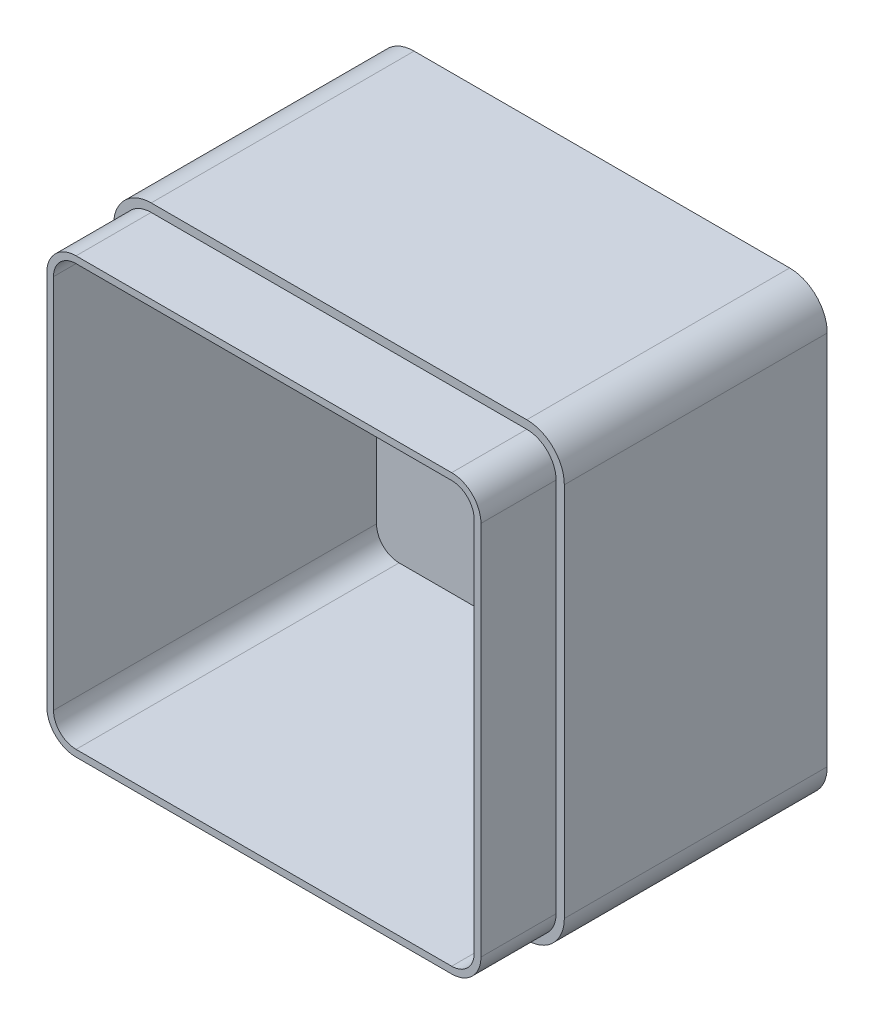
ISO-10303-21;
HEADER;
FILE_DESCRIPTION(('STEP AP214'),'2;1');
FILE_NAME('part.step','',(''),(''),'','','');
FILE_SCHEMA(('AUTOMOTIVE_DESIGN { 1 0 10303 214 1 1 1 1 }'));
ENDSEC;
DATA;
#1=APPLICATION_CONTEXT('core data for automotive mechanical design processes');
#2=APPLICATION_PROTOCOL_DEFINITION('international standard','automotive_design',2000,#1);
#3=PRODUCT_CONTEXT('',#1,'mechanical');
#4=PRODUCT('Part','Part','',(#3));
#5=PRODUCT_RELATED_PRODUCT_CATEGORY('part','',(#4));
#6=PRODUCT_DEFINITION_FORMATION('','',#4);
#7=PRODUCT_DEFINITION_CONTEXT('part definition',#1,'design');
#8=PRODUCT_DEFINITION('design','',#6,#7);
#9=PRODUCT_DEFINITION_SHAPE('','',#8);
#10=(LENGTH_UNIT() NAMED_UNIT(*) SI_UNIT(.MILLI.,.METRE.));
#11=(NAMED_UNIT(*) PLANE_ANGLE_UNIT() SI_UNIT($,.RADIAN.));
#12=(NAMED_UNIT(*) SI_UNIT($,.STERADIAN.) SOLID_ANGLE_UNIT());
#13=UNCERTAINTY_MEASURE_WITH_UNIT(LENGTH_MEASURE(1.E-05),#10,'distance_accuracy_value','');
#14=(GEOMETRIC_REPRESENTATION_CONTEXT(3) GLOBAL_UNCERTAINTY_ASSIGNED_CONTEXT((#13)) GLOBAL_UNIT_ASSIGNED_CONTEXT((#10,
#11,#12)) REPRESENTATION_CONTEXT('',''));
#15=CARTESIAN_POINT('',(0.,0.,0.));
#16=DIRECTION('',(0.,0.,1.));
#17=DIRECTION('',(1.,0.,0.));
#18=AXIS2_PLACEMENT_3D('',#15,#16,#17);
#19=CARTESIAN_POINT('',(0.,0.,90.));
#20=DIRECTION('',(0.,0.,-1.));
#21=DIRECTION('',(-1.,0.,0.));
#22=AXIS2_PLACEMENT_3D('',#19,#20,#21);
#23=PLANE('',#22);
#24=DIRECTION('',(0.,-1.,0.));
#25=VECTOR('',#24,1.);
#26=CARTESIAN_POINT('',(4.,0.,90.));
#27=LINE('',#26,#25);
#28=CARTESIAN_POINT('',(4.,110.,90.));
#29=VERTEX_POINT('',#28);
#30=CARTESIAN_POINT('',(4.,9.99999999999999,90.));
#31=VERTEX_POINT('',#30);
#32=EDGE_CURVE('E318',#29,#31,#27,.T.);
#33=ORIENTED_EDGE('',*,*,#32,.F.);
#34=CARTESIAN_POINT('',(10.,110.,90.));
#35=DIRECTION('',(0.,0.,-1.));
#36=DIRECTION('',(-1.,0.,0.));
#37=AXIS2_PLACEMENT_3D('',#34,#35,#36);
#38=CIRCLE('',#37,6.);
#39=CARTESIAN_POINT('',(9.99999999999999,116.,90.));
#40=VERTEX_POINT('',#39);
#41=EDGE_CURVE('E301',#40,#29,#38,.F.);
#42=ORIENTED_EDGE('',*,*,#41,.F.);
#43=DIRECTION('',(-1.,0.,0.));
#44=VECTOR('',#43,1.);
#45=CARTESIAN_POINT('',(0.,116.,90.));
#46=LINE('',#45,#44);
#47=CARTESIAN_POINT('',(110.,116.,90.));
#48=VERTEX_POINT('',#47);
#49=EDGE_CURVE('E327',#48,#40,#46,.T.);
#50=ORIENTED_EDGE('',*,*,#49,.F.);
#51=CARTESIAN_POINT('',(110.,110.,90.));
#52=DIRECTION('',(0.,0.,-1.));
#53=DIRECTION('',(-1.,0.,0.));
#54=AXIS2_PLACEMENT_3D('',#51,#52,#53);
#55=CIRCLE('',#54,6.);
#56=CARTESIAN_POINT('',(116.,110.,90.));
#57=VERTEX_POINT('',#56);
#58=EDGE_CURVE('E350',#57,#48,#55,.F.);
#59=ORIENTED_EDGE('',*,*,#58,.F.);
#60=DIRECTION('',(0.,1.,0.));
#61=VECTOR('',#60,1.);
#62=CARTESIAN_POINT('',(116.,0.,90.));
#63=LINE('',#62,#61);
#64=CARTESIAN_POINT('',(116.,9.99999999999999,90.));
#65=VERTEX_POINT('',#64);
#66=EDGE_CURVE('E348',#65,#57,#63,.T.);
#67=ORIENTED_EDGE('',*,*,#66,.F.);
#68=CARTESIAN_POINT('',(110.,10.,90.));
#69=DIRECTION('',(0.,0.,-1.));
#70=DIRECTION('',(-1.,0.,0.));
#71=AXIS2_PLACEMENT_3D('',#68,#69,#70);
#72=CIRCLE('',#71,6.);
#73=CARTESIAN_POINT('',(110.,4.,90.));
#74=VERTEX_POINT('',#73);
#75=EDGE_CURVE('E345',#74,#65,#72,.F.);
#76=ORIENTED_EDGE('',*,*,#75,.F.);
#77=DIRECTION('',(1.,0.,0.));
#78=VECTOR('',#77,1.);
#79=CARTESIAN_POINT('',(0.,4.,90.));
#80=LINE('',#79,#78);
#81=CARTESIAN_POINT('',(9.99999999999999,4.,90.));
#82=VERTEX_POINT('',#81);
#83=EDGE_CURVE('E343',#82,#74,#80,.T.);
#84=ORIENTED_EDGE('',*,*,#83,.F.);
#85=CARTESIAN_POINT('',(10.,10.,90.));
#86=DIRECTION('',(0.,0.,-1.));
#87=DIRECTION('',(-1.,0.,0.));
#88=AXIS2_PLACEMENT_3D('',#85,#86,#87);
#89=CIRCLE('',#88,6.);
#90=EDGE_CURVE('E334',#31,#82,#89,.F.);
#91=ORIENTED_EDGE('',*,*,#90,.F.);
#92=EDGE_LOOP('',(#33,#42,#50,#59,#67,#76,#84,#91));
#93=FACE_BOUND('',#92,.T.);
#94=CARTESIAN_POINT('',(10.,110.,90.));
#95=DIRECTION('',(0.,0.,1.));
#96=DIRECTION('',(1.,0.,0.));
#97=AXIS2_PLACEMENT_3D('',#94,#95,#96);
#98=CIRCLE('',#97,7.79999999999999);
#99=CARTESIAN_POINT('',(9.99999999999999,117.8,90.));
#100=VERTEX_POINT('',#99);
#101=CARTESIAN_POINT('',(2.2,110.,90.));
#102=VERTEX_POINT('',#101);
#103=EDGE_CURVE('E253',#100,#102,#98,.T.);
#104=ORIENTED_EDGE('',*,*,#103,.T.);
#105=DIRECTION('',(0.,-1.,0.));
#106=VECTOR('',#105,1.);
#107=CARTESIAN_POINT('',(2.2,110.,90.));
#108=LINE('',#107,#106);
#109=CARTESIAN_POINT('',(2.20000000000001,9.99999999999999,90.));
#110=VERTEX_POINT('',#109);
#111=EDGE_CURVE('E210',#102,#110,#108,.T.);
#112=ORIENTED_EDGE('',*,*,#111,.T.);
#113=CARTESIAN_POINT('',(10.,10.,90.));
#114=DIRECTION('',(0.,0.,1.));
#115=DIRECTION('',(1.,0.,0.));
#116=AXIS2_PLACEMENT_3D('',#113,#114,#115);
#117=CIRCLE('',#116,7.79999999999999);
#118=CARTESIAN_POINT('',(9.99999999999999,2.20000000000001,90.));
#119=VERTEX_POINT('',#118);
#120=EDGE_CURVE('E59',#110,#119,#117,.T.);
#121=ORIENTED_EDGE('',*,*,#120,.T.);
#122=DIRECTION('',(1.,0.,0.));
#123=VECTOR('',#122,1.);
#124=CARTESIAN_POINT('',(9.99999999999999,2.2,90.));
#125=LINE('',#124,#123);
#126=CARTESIAN_POINT('',(110.,2.2,90.));
#127=VERTEX_POINT('',#126);
#128=EDGE_CURVE('E257',#119,#127,#125,.T.);
#129=ORIENTED_EDGE('',*,*,#128,.T.);
#130=CARTESIAN_POINT('',(110.,10.,90.));
#131=DIRECTION('',(0.,0.,1.));
#132=DIRECTION('',(1.,0.,0.));
#133=AXIS2_PLACEMENT_3D('',#130,#131,#132);
#134=CIRCLE('',#133,7.79999999999999);
#135=CARTESIAN_POINT('',(117.8,10.,90.));
#136=VERTEX_POINT('',#135);
#137=EDGE_CURVE('E260',#127,#136,#134,.T.);
#138=ORIENTED_EDGE('',*,*,#137,.T.);
#139=DIRECTION('',(0.,1.,0.));
#140=VECTOR('',#139,1.);
#141=CARTESIAN_POINT('',(117.8,9.99999999999999,90.));
#142=LINE('',#141,#140);
#143=CARTESIAN_POINT('',(117.8,110.,90.));
#144=VERTEX_POINT('',#143);
#145=EDGE_CURVE('E263',#136,#144,#142,.T.);
#146=ORIENTED_EDGE('',*,*,#145,.T.);
#147=CARTESIAN_POINT('',(110.,110.,90.));
#148=DIRECTION('',(0.,0.,1.));
#149=DIRECTION('',(1.,0.,0.));
#150=AXIS2_PLACEMENT_3D('',#147,#148,#149);
#151=CIRCLE('',#150,7.8);
#152=CARTESIAN_POINT('',(110.,117.8,90.));
#153=VERTEX_POINT('',#152);
#154=EDGE_CURVE('E233',#144,#153,#151,.T.);
#155=ORIENTED_EDGE('',*,*,#154,.T.);
#156=DIRECTION('',(-1.,0.,0.));
#157=VECTOR('',#156,1.);
#158=CARTESIAN_POINT('',(110.,117.8,90.));
#159=LINE('',#158,#157);
#160=EDGE_CURVE('E230',#153,#100,#159,.T.);
#161=ORIENTED_EDGE('',*,*,#160,.T.);
#162=EDGE_LOOP('',(#104,#112,#121,#129,#138,#146,#155,#161));
#163=FACE_BOUND('',#162,.T.);
#164=ADVANCED_FACE('F44',(#93,#163),#23,.F.);
#165=CARTESIAN_POINT('',(4.,0.,90.));
#166=DIRECTION('',(1.,0.,0.));
#167=DIRECTION('',(0.,0.,-1.));
#168=AXIS2_PLACEMENT_3D('',#165,#166,#167);
#169=PLANE('',#168);
#170=DIRECTION('',(0.,-1.,0.));
#171=VECTOR('',#170,1.);
#172=CARTESIAN_POINT('',(4.,0.,4.));
#173=LINE('',#172,#171);
#174=CARTESIAN_POINT('',(4.,110.,4.));
#175=VERTEX_POINT('',#174);
#176=CARTESIAN_POINT('',(4.,9.99999999999999,4.));
#177=VERTEX_POINT('',#176);
#178=EDGE_CURVE('E295',#175,#177,#173,.T.);
#179=ORIENTED_EDGE('',*,*,#178,.F.);
#180=DIRECTION('',(0.,0.,-1.));
#181=VECTOR('',#180,1.);
#182=CARTESIAN_POINT('',(4.,110.,90.));
#183=LINE('',#182,#181);
#184=EDGE_CURVE('E302',#29,#175,#183,.T.);
#185=ORIENTED_EDGE('',*,*,#184,.F.);
#186=ORIENTED_EDGE('',*,*,#32,.T.);
#187=DIRECTION('',(0.,0.,-1.));
#188=VECTOR('',#187,1.);
#189=CARTESIAN_POINT('',(4.,9.99999999999999,90.));
#190=LINE('',#189,#188);
#191=EDGE_CURVE('E299',#177,#31,#190,.F.);
#192=ORIENTED_EDGE('',*,*,#191,.F.);
#193=EDGE_LOOP('',(#179,#185,#186,#192));
#194=FACE_BOUND('',#193,.T.);
#195=ADVANCED_FACE('F444',(#194),#169,.T.);
#196=CARTESIAN_POINT('',(0.,4.,90.));
#197=DIRECTION('',(0.,1.,0.));
#198=DIRECTION('',(0.,0.,1.));
#199=AXIS2_PLACEMENT_3D('',#196,#197,#198);
#200=PLANE('',#199);
#201=ORIENTED_EDGE('',*,*,#83,.T.);
#202=DIRECTION('',(0.,0.,1.));
#203=VECTOR('',#202,1.);
#204=CARTESIAN_POINT('',(110.,4.,90.));
#205=LINE('',#204,#203);
#206=CARTESIAN_POINT('',(110.,4.,4.));
#207=VERTEX_POINT('',#206);
#208=EDGE_CURVE('E325',#207,#74,#205,.T.);
#209=ORIENTED_EDGE('',*,*,#208,.F.);
#210=DIRECTION('',(1.,0.,0.));
#211=VECTOR('',#210,1.);
#212=CARTESIAN_POINT('',(0.,4.,4.));
#213=LINE('',#212,#211);
#214=CARTESIAN_POINT('',(9.99999999999999,4.,4.));
#215=VERTEX_POINT('',#214);
#216=EDGE_CURVE('E298',#215,#207,#213,.T.);
#217=ORIENTED_EDGE('',*,*,#216,.F.);
#218=DIRECTION('',(0.,0.,1.));
#219=VECTOR('',#218,1.);
#220=CARTESIAN_POINT('',(9.99999999999999,4.,90.));
#221=LINE('',#220,#219);
#222=EDGE_CURVE('E314',#82,#215,#221,.F.);
#223=ORIENTED_EDGE('',*,*,#222,.F.);
#224=EDGE_LOOP('',(#201,#209,#217,#223));
#225=FACE_BOUND('',#224,.T.);
#226=ADVANCED_FACE('F451',(#225),#200,.T.);
#227=CARTESIAN_POINT('',(116.,0.,90.));
#228=DIRECTION('',(-1.,0.,0.));
#229=DIRECTION('',(0.,0.,1.));
#230=AXIS2_PLACEMENT_3D('',#227,#228,#229);
#231=PLANE('',#230);
#232=ORIENTED_EDGE('',*,*,#66,.T.);
#233=DIRECTION('',(0.,0.,1.));
#234=VECTOR('',#233,1.);
#235=CARTESIAN_POINT('',(116.,110.,90.));
#236=LINE('',#235,#234);
#237=CARTESIAN_POINT('',(116.,110.,4.));
#238=VERTEX_POINT('',#237);
#239=EDGE_CURVE('E332',#238,#57,#236,.T.);
#240=ORIENTED_EDGE('',*,*,#239,.F.);
#241=DIRECTION('',(0.,1.,0.));
#242=VECTOR('',#241,1.);
#243=CARTESIAN_POINT('',(116.,0.,4.));
#244=LINE('',#243,#242);
#245=CARTESIAN_POINT('',(116.,9.99999999999999,4.));
#246=VERTEX_POINT('',#245);
#247=EDGE_CURVE('E308',#246,#238,#244,.T.);
#248=ORIENTED_EDGE('',*,*,#247,.F.);
#249=DIRECTION('',(0.,0.,1.));
#250=VECTOR('',#249,1.);
#251=CARTESIAN_POINT('',(116.,9.99999999999999,90.));
#252=LINE('',#251,#250);
#253=EDGE_CURVE('E328',#65,#246,#252,.F.);
#254=ORIENTED_EDGE('',*,*,#253,.F.);
#255=EDGE_LOOP('',(#232,#240,#248,#254));
#256=FACE_BOUND('',#255,.T.);
#257=ADVANCED_FACE('F478',(#256),#231,.T.);
#258=CARTESIAN_POINT('',(0.,116.,90.));
#259=DIRECTION('',(0.,-1.,0.));
#260=DIRECTION('',(0.,0.,-1.));
#261=AXIS2_PLACEMENT_3D('',#258,#259,#260);
#262=PLANE('',#261);
#263=ORIENTED_EDGE('',*,*,#49,.T.);
#264=DIRECTION('',(0.,0.,-1.));
#265=VECTOR('',#264,1.);
#266=CARTESIAN_POINT('',(9.99999999999999,116.,90.));
#267=LINE('',#266,#265);
#268=CARTESIAN_POINT('',(9.99999999999999,116.,4.));
#269=VERTEX_POINT('',#268);
#270=EDGE_CURVE('E331',#269,#40,#267,.F.);
#271=ORIENTED_EDGE('',*,*,#270,.F.);
#272=DIRECTION('',(-1.,0.,0.));
#273=VECTOR('',#272,1.);
#274=CARTESIAN_POINT('',(0.,116.,4.));
#275=LINE('',#274,#273);
#276=CARTESIAN_POINT('',(110.,116.,4.));
#277=VERTEX_POINT('',#276);
#278=EDGE_CURVE('E315',#277,#269,#275,.T.);
#279=ORIENTED_EDGE('',*,*,#278,.F.);
#280=DIRECTION('',(0.,0.,-1.));
#281=VECTOR('',#280,1.);
#282=CARTESIAN_POINT('',(110.,116.,90.));
#283=LINE('',#282,#281);
#284=EDGE_CURVE('E335',#48,#277,#283,.T.);
#285=ORIENTED_EDGE('',*,*,#284,.F.);
#286=EDGE_LOOP('',(#263,#271,#279,#285));
#287=FACE_BOUND('',#286,.T.);
#288=ADVANCED_FACE('F474',(#287),#262,.T.);
#289=CARTESIAN_POINT('',(0.,0.,4.));
#290=DIRECTION('',(0.,0.,-1.));
#291=DIRECTION('',(-1.,0.,0.));
#292=AXIS2_PLACEMENT_3D('',#289,#290,#291);
#293=PLANE('',#292);
#294=CARTESIAN_POINT('',(19.0500000000001,100.95,4.));
#295=DIRECTION('',(0.,0.,-1.));
#296=DIRECTION('',(-1.,0.,0.));
#297=AXIS2_PLACEMENT_3D('',#294,#295,#296);
#298=CIRCLE('',#297,6.34999999999999);
#299=CARTESIAN_POINT('',(25.4000000000001,100.95,4.));
#300=VERTEX_POINT('',#299);
#301=EDGE_CURVE('E236',#300,#300,#298,.T.);
#302=ORIENTED_EDGE('',*,*,#301,.T.);
#303=EDGE_LOOP('',(#302));
#304=FACE_BOUND('',#303,.T.);
#305=ORIENTED_EDGE('',*,*,#216,.T.);
#306=CARTESIAN_POINT('',(110.,10.,4.));
#307=DIRECTION('',(0.,0.,-1.));
#308=DIRECTION('',(-1.,0.,0.));
#309=AXIS2_PLACEMENT_3D('',#306,#307,#308);
#310=CIRCLE('',#309,6.);
#311=EDGE_CURVE('E310',#246,#207,#310,.T.);
#312=ORIENTED_EDGE('',*,*,#311,.F.);
#313=ORIENTED_EDGE('',*,*,#247,.T.);
#314=CARTESIAN_POINT('',(110.,110.,4.));
#315=DIRECTION('',(0.,0.,-1.));
#316=DIRECTION('',(-1.,0.,0.));
#317=AXIS2_PLACEMENT_3D('',#314,#315,#316);
#318=CIRCLE('',#317,6.);
#319=EDGE_CURVE('E313',#277,#238,#318,.T.);
#320=ORIENTED_EDGE('',*,*,#319,.F.);
#321=ORIENTED_EDGE('',*,*,#278,.T.);
#322=CARTESIAN_POINT('',(10.,110.,4.));
#323=DIRECTION('',(0.,0.,-1.));
#324=DIRECTION('',(-1.,0.,0.));
#325=AXIS2_PLACEMENT_3D('',#322,#323,#324);
#326=CIRCLE('',#325,6.);
#327=EDGE_CURVE('E311',#175,#269,#326,.T.);
#328=ORIENTED_EDGE('',*,*,#327,.F.);
#329=ORIENTED_EDGE('',*,*,#178,.T.);
#330=CARTESIAN_POINT('',(10.,10.,4.));
#331=DIRECTION('',(0.,0.,-1.));
#332=DIRECTION('',(-1.,0.,0.));
#333=AXIS2_PLACEMENT_3D('',#330,#331,#332);
#334=CIRCLE('',#333,6.);
#335=EDGE_CURVE('E305',#215,#177,#334,.T.);
#336=ORIENTED_EDGE('',*,*,#335,.F.);
#337=EDGE_LOOP('',(#305,#312,#313,#320,#321,#328,#329,#336));
#338=FACE_BOUND('',#337,.T.);
#339=ADVANCED_FACE('F471',(#304,#338),#293,.F.);
#340=CARTESIAN_POINT('',(10.,10.,90.));
#341=DIRECTION('',(0.,0.,-1.));
#342=DIRECTION('',(-1.,0.,0.));
#343=AXIS2_PLACEMENT_3D('',#340,#341,#342);
#344=CYLINDRICAL_SURFACE('',#343,6.);
#345=ORIENTED_EDGE('',*,*,#90,.T.);
#346=ORIENTED_EDGE('',*,*,#222,.T.);
#347=ORIENTED_EDGE('',*,*,#335,.T.);
#348=ORIENTED_EDGE('',*,*,#191,.T.);
#349=EDGE_LOOP('',(#345,#346,#347,#348));
#350=FACE_BOUND('',#349,.T.);
#351=ADVANCED_FACE('F467',(#350),#344,.F.);
#352=CARTESIAN_POINT('',(110.,10.,90.));
#353=DIRECTION('',(0.,0.,-1.));
#354=DIRECTION('',(-1.,0.,0.));
#355=AXIS2_PLACEMENT_3D('',#352,#353,#354);
#356=CYLINDRICAL_SURFACE('',#355,6.);
#357=ORIENTED_EDGE('',*,*,#75,.T.);
#358=ORIENTED_EDGE('',*,*,#253,.T.);
#359=ORIENTED_EDGE('',*,*,#311,.T.);
#360=ORIENTED_EDGE('',*,*,#208,.T.);
#361=EDGE_LOOP('',(#357,#358,#359,#360));
#362=FACE_BOUND('',#361,.T.);
#363=ADVANCED_FACE('F463',(#362),#356,.F.);
#364=CARTESIAN_POINT('',(110.,110.,90.));
#365=DIRECTION('',(0.,0.,-1.));
#366=DIRECTION('',(-1.,0.,0.));
#367=AXIS2_PLACEMENT_3D('',#364,#365,#366);
#368=CYLINDRICAL_SURFACE('',#367,6.);
#369=ORIENTED_EDGE('',*,*,#58,.T.);
#370=ORIENTED_EDGE('',*,*,#284,.T.);
#371=ORIENTED_EDGE('',*,*,#319,.T.);
#372=ORIENTED_EDGE('',*,*,#239,.T.);
#373=EDGE_LOOP('',(#369,#370,#371,#372));
#374=FACE_BOUND('',#373,.T.);
#375=ADVANCED_FACE('F459',(#374),#368,.F.);
#376=CARTESIAN_POINT('',(10.,110.,90.));
#377=DIRECTION('',(0.,0.,-1.));
#378=DIRECTION('',(-1.,0.,0.));
#379=AXIS2_PLACEMENT_3D('',#376,#377,#378);
#380=CYLINDRICAL_SURFACE('',#379,6.);
#381=ORIENTED_EDGE('',*,*,#41,.T.);
#382=ORIENTED_EDGE('',*,*,#184,.T.);
#383=ORIENTED_EDGE('',*,*,#327,.T.);
#384=ORIENTED_EDGE('',*,*,#270,.T.);
#385=EDGE_LOOP('',(#381,#382,#383,#384));
#386=FACE_BOUND('',#385,.T.);
#387=ADVANCED_FACE('F457',(#386),#380,.F.);
#388=CARTESIAN_POINT('',(10.,110.,70.));
#389=DIRECTION('',(0.,0.,1.));
#390=DIRECTION('',(1.,0.,0.));
#391=AXIS2_PLACEMENT_3D('',#388,#389,#390);
#392=PLANE('',#391);
#393=DIRECTION('',(-1.,0.,0.));
#394=VECTOR('',#393,1.);
#395=CARTESIAN_POINT('',(110.,117.8,70.));
#396=LINE('',#395,#394);
#397=CARTESIAN_POINT('',(110.,117.8,70.));
#398=VERTEX_POINT('',#397);
#399=CARTESIAN_POINT('',(9.99999999999999,117.8,70.));
#400=VERTEX_POINT('',#399);
#401=EDGE_CURVE('E216',#398,#400,#396,.T.);
#402=ORIENTED_EDGE('',*,*,#401,.F.);
#403=CARTESIAN_POINT('',(110.,110.,70.));
#404=DIRECTION('',(0.,0.,1.));
#405=DIRECTION('',(1.,0.,0.));
#406=AXIS2_PLACEMENT_3D('',#403,#404,#405);
#407=CIRCLE('',#406,7.8);
#408=CARTESIAN_POINT('',(117.8,110.,70.));
#409=VERTEX_POINT('',#408);
#410=EDGE_CURVE('E249',#409,#398,#407,.T.);
#411=ORIENTED_EDGE('',*,*,#410,.F.);
#412=DIRECTION('',(0.,1.,0.));
#413=VECTOR('',#412,1.);
#414=CARTESIAN_POINT('',(117.8,9.99999999999999,70.));
#415=LINE('',#414,#413);
#416=CARTESIAN_POINT('',(117.8,10.,70.));
#417=VERTEX_POINT('',#416);
#418=EDGE_CURVE('E246',#417,#409,#415,.T.);
#419=ORIENTED_EDGE('',*,*,#418,.F.);
#420=CARTESIAN_POINT('',(110.,10.,70.));
#421=DIRECTION('',(0.,0.,1.));
#422=DIRECTION('',(1.,0.,0.));
#423=AXIS2_PLACEMENT_3D('',#420,#421,#422);
#424=CIRCLE('',#423,7.79999999999999);
#425=CARTESIAN_POINT('',(110.,2.2,70.));
#426=VERTEX_POINT('',#425);
#427=EDGE_CURVE('E243',#426,#417,#424,.T.);
#428=ORIENTED_EDGE('',*,*,#427,.F.);
#429=DIRECTION('',(1.,0.,0.));
#430=VECTOR('',#429,1.);
#431=CARTESIAN_POINT('',(9.99999999999999,2.2,70.));
#432=LINE('',#431,#430);
#433=CARTESIAN_POINT('',(9.99999999999999,2.20000000000001,70.));
#434=VERTEX_POINT('',#433);
#435=EDGE_CURVE('E240',#434,#426,#432,.T.);
#436=ORIENTED_EDGE('',*,*,#435,.F.);
#437=CARTESIAN_POINT('',(10.,10.,70.));
#438=DIRECTION('',(0.,0.,1.));
#439=DIRECTION('',(1.,0.,0.));
#440=AXIS2_PLACEMENT_3D('',#437,#438,#439);
#441=CIRCLE('',#440,7.79999999999999);
#442=CARTESIAN_POINT('',(2.20000000000001,9.99999999999999,70.));
#443=VERTEX_POINT('',#442);
#444=EDGE_CURVE('E226',#443,#434,#441,.T.);
#445=ORIENTED_EDGE('',*,*,#444,.F.);
#446=DIRECTION('',(0.,-1.,0.));
#447=VECTOR('',#446,1.);
#448=CARTESIAN_POINT('',(2.2,110.,70.));
#449=LINE('',#448,#447);
#450=CARTESIAN_POINT('',(2.2,110.,70.));
#451=VERTEX_POINT('',#450);
#452=EDGE_CURVE('E208',#451,#443,#449,.T.);
#453=ORIENTED_EDGE('',*,*,#452,.F.);
#454=CARTESIAN_POINT('',(10.,110.,70.));
#455=DIRECTION('',(0.,0.,1.));
#456=DIRECTION('',(1.,0.,0.));
#457=AXIS2_PLACEMENT_3D('',#454,#455,#456);
#458=CIRCLE('',#457,7.79999999999999);
#459=EDGE_CURVE('E222',#400,#451,#458,.T.);
#460=ORIENTED_EDGE('',*,*,#459,.F.);
#461=EDGE_LOOP('',(#402,#411,#419,#428,#436,#445,#453,#460));
#462=FACE_BOUND('',#461,.T.);
#463=CARTESIAN_POINT('',(10.,110.,70.));
#464=DIRECTION('',(0.,0.,1.));
#465=DIRECTION('',(1.,0.,0.));
#466=AXIS2_PLACEMENT_3D('',#463,#464,#465);
#467=CIRCLE('',#466,10.);
#468=CARTESIAN_POINT('',(10.,120.,70.));
#469=VERTEX_POINT('',#468);
#470=CARTESIAN_POINT('',(0.,110.,70.));
#471=VERTEX_POINT('',#470);
#472=EDGE_CURVE('E269',#469,#471,#467,.T.);
#473=ORIENTED_EDGE('',*,*,#472,.T.);
#474=DIRECTION('',(0.,-1.,0.));
#475=VECTOR('',#474,1.);
#476=CARTESIAN_POINT('',(0.,110.,70.));
#477=LINE('',#476,#475);
#478=CARTESIAN_POINT('',(0.,9.99999999999999,70.));
#479=VERTEX_POINT('',#478);
#480=EDGE_CURVE('E282',#471,#479,#477,.T.);
#481=ORIENTED_EDGE('',*,*,#480,.T.);
#482=CARTESIAN_POINT('',(10.,10.,70.));
#483=DIRECTION('',(0.,0.,1.));
#484=DIRECTION('',(1.,0.,0.));
#485=AXIS2_PLACEMENT_3D('',#482,#483,#484);
#486=CIRCLE('',#485,10.);
#487=CARTESIAN_POINT('',(9.99999999999999,0.,70.));
#488=VERTEX_POINT('',#487);
#489=EDGE_CURVE('E284',#479,#488,#486,.T.);
#490=ORIENTED_EDGE('',*,*,#489,.T.);
#491=DIRECTION('',(1.,0.,0.));
#492=VECTOR('',#491,1.);
#493=CARTESIAN_POINT('',(9.99999999999999,0.,70.));
#494=LINE('',#493,#492);
#495=CARTESIAN_POINT('',(110.,0.,70.));
#496=VERTEX_POINT('',#495);
#497=EDGE_CURVE('E286',#488,#496,#494,.T.);
#498=ORIENTED_EDGE('',*,*,#497,.T.);
#499=CARTESIAN_POINT('',(110.,10.,70.));
#500=DIRECTION('',(0.,0.,1.));
#501=DIRECTION('',(1.,0.,0.));
#502=AXIS2_PLACEMENT_3D('',#499,#500,#501);
#503=CIRCLE('',#502,9.99999999999999);
#504=CARTESIAN_POINT('',(120.,10.,70.));
#505=VERTEX_POINT('',#504);
#506=EDGE_CURVE('E288',#496,#505,#503,.T.);
#507=ORIENTED_EDGE('',*,*,#506,.T.);
#508=DIRECTION('',(0.,1.,0.));
#509=VECTOR('',#508,1.);
#510=CARTESIAN_POINT('',(120.,10.,70.));
#511=LINE('',#510,#509);
#512=CARTESIAN_POINT('',(120.,110.,70.));
#513=VERTEX_POINT('',#512);
#514=EDGE_CURVE('E290',#505,#513,#511,.T.);
#515=ORIENTED_EDGE('',*,*,#514,.T.);
#516=CARTESIAN_POINT('',(110.,110.,70.));
#517=DIRECTION('',(0.,0.,1.));
#518=DIRECTION('',(1.,0.,0.));
#519=AXIS2_PLACEMENT_3D('',#516,#517,#518);
#520=CIRCLE('',#519,9.99999999999999);
#521=CARTESIAN_POINT('',(110.,120.,70.));
#522=VERTEX_POINT('',#521);
#523=EDGE_CURVE('E292',#513,#522,#520,.T.);
#524=ORIENTED_EDGE('',*,*,#523,.T.);
#525=DIRECTION('',(-1.,0.,0.));
#526=VECTOR('',#525,1.);
#527=CARTESIAN_POINT('',(110.,120.,70.));
#528=LINE('',#527,#526);
#529=EDGE_CURVE('E67',#522,#469,#528,.T.);
#530=ORIENTED_EDGE('',*,*,#529,.T.);
#531=EDGE_LOOP('',(#473,#481,#490,#498,#507,#515,#524,#530));
#532=FACE_BOUND('',#531,.T.);
#533=ADVANCED_FACE('F221',(#462,#532),#392,.T.);
#534=CARTESIAN_POINT('',(10.,110.,70.));
#535=DIRECTION('',(0.,0.,1.));
#536=DIRECTION('',(1.,0.,0.));
#537=AXIS2_PLACEMENT_3D('',#534,#535,#536);
#538=CYLINDRICAL_SURFACE('',#537,7.79999999999999);
#539=ORIENTED_EDGE('',*,*,#103,.F.);
#540=DIRECTION('',(0.,0.,1.));
#541=VECTOR('',#540,1.);
#542=CARTESIAN_POINT('',(9.99999999999999,117.8,70.));
#543=LINE('',#542,#541);
#544=EDGE_CURVE('E229',#400,#100,#543,.T.);
#545=ORIENTED_EDGE('',*,*,#544,.F.);
#546=ORIENTED_EDGE('',*,*,#459,.T.);
#547=DIRECTION('',(0.,0.,1.));
#548=VECTOR('',#547,1.);
#549=CARTESIAN_POINT('',(2.2,110.,70.));
#550=LINE('',#549,#548);
#551=EDGE_CURVE('E205',#451,#102,#550,.T.);
#552=ORIENTED_EDGE('',*,*,#551,.T.);
#553=EDGE_LOOP('',(#539,#545,#546,#552));
#554=FACE_BOUND('',#553,.T.);
#555=ADVANCED_FACE('F228',(#554),#538,.T.);
#556=CARTESIAN_POINT('',(110.,117.8,70.));
#557=DIRECTION('',(0.,1.,0.));
#558=DIRECTION('',(-1.,0.,0.));
#559=AXIS2_PLACEMENT_3D('',#556,#557,#558);
#560=PLANE('',#559);
#561=ORIENTED_EDGE('',*,*,#160,.F.);
#562=DIRECTION('',(0.,0.,1.));
#563=VECTOR('',#562,1.);
#564=CARTESIAN_POINT('',(110.,117.8,70.));
#565=LINE('',#564,#563);
#566=EDGE_CURVE('E270',#398,#153,#565,.T.);
#567=ORIENTED_EDGE('',*,*,#566,.F.);
#568=ORIENTED_EDGE('',*,*,#401,.T.);
#569=ORIENTED_EDGE('',*,*,#544,.T.);
#570=EDGE_LOOP('',(#561,#567,#568,#569));
#571=FACE_BOUND('',#570,.T.);
#572=ADVANCED_FACE('F488',(#571),#560,.T.);
#573=CARTESIAN_POINT('',(110.,110.,70.));
#574=DIRECTION('',(0.,0.,1.));
#575=DIRECTION('',(1.,0.,0.));
#576=AXIS2_PLACEMENT_3D('',#573,#574,#575);
#577=CYLINDRICAL_SURFACE('',#576,7.8);
#578=ORIENTED_EDGE('',*,*,#154,.F.);
#579=DIRECTION('',(0.,0.,1.));
#580=VECTOR('',#579,1.);
#581=CARTESIAN_POINT('',(117.8,110.,70.));
#582=LINE('',#581,#580);
#583=EDGE_CURVE('E272',#409,#144,#582,.T.);
#584=ORIENTED_EDGE('',*,*,#583,.F.);
#585=ORIENTED_EDGE('',*,*,#410,.T.);
#586=ORIENTED_EDGE('',*,*,#566,.T.);
#587=EDGE_LOOP('',(#578,#584,#585,#586));
#588=FACE_BOUND('',#587,.T.);
#589=ADVANCED_FACE('F503',(#588),#577,.T.);
#590=CARTESIAN_POINT('',(117.8,9.99999999999999,70.));
#591=DIRECTION('',(1.,0.,0.));
#592=DIRECTION('',(0.,1.,0.));
#593=AXIS2_PLACEMENT_3D('',#590,#591,#592);
#594=PLANE('',#593);
#595=ORIENTED_EDGE('',*,*,#145,.F.);
#596=DIRECTION('',(0.,0.,1.));
#597=VECTOR('',#596,1.);
#598=CARTESIAN_POINT('',(117.8,10.,70.));
#599=LINE('',#598,#597);
#600=EDGE_CURVE('E274',#417,#136,#599,.T.);
#601=ORIENTED_EDGE('',*,*,#600,.F.);
#602=ORIENTED_EDGE('',*,*,#418,.T.);
#603=ORIENTED_EDGE('',*,*,#583,.T.);
#604=EDGE_LOOP('',(#595,#601,#602,#603));
#605=FACE_BOUND('',#604,.T.);
#606=ADVANCED_FACE('F499',(#605),#594,.T.);
#607=CARTESIAN_POINT('',(110.,10.,70.));
#608=DIRECTION('',(0.,0.,1.));
#609=DIRECTION('',(1.,0.,0.));
#610=AXIS2_PLACEMENT_3D('',#607,#608,#609);
#611=CYLINDRICAL_SURFACE('',#610,7.79999999999999);
#612=ORIENTED_EDGE('',*,*,#137,.F.);
#613=DIRECTION('',(0.,0.,1.));
#614=VECTOR('',#613,1.);
#615=CARTESIAN_POINT('',(110.,2.2,70.));
#616=LINE('',#615,#614);
#617=EDGE_CURVE('E276',#426,#127,#616,.T.);
#618=ORIENTED_EDGE('',*,*,#617,.F.);
#619=ORIENTED_EDGE('',*,*,#427,.T.);
#620=ORIENTED_EDGE('',*,*,#600,.T.);
#621=EDGE_LOOP('',(#612,#618,#619,#620));
#622=FACE_BOUND('',#621,.T.);
#623=ADVANCED_FACE('F495',(#622),#611,.T.);
#624=CARTESIAN_POINT('',(9.99999999999999,2.2,70.));
#625=DIRECTION('',(0.,-1.,0.));
#626=DIRECTION('',(1.,0.,0.));
#627=AXIS2_PLACEMENT_3D('',#624,#625,#626);
#628=PLANE('',#627);
#629=ORIENTED_EDGE('',*,*,#128,.F.);
#630=DIRECTION('',(0.,0.,1.));
#631=VECTOR('',#630,1.);
#632=CARTESIAN_POINT('',(9.99999999999999,2.20000000000001,70.));
#633=LINE('',#632,#631);
#634=EDGE_CURVE('E278',#434,#119,#633,.T.);
#635=ORIENTED_EDGE('',*,*,#634,.F.);
#636=ORIENTED_EDGE('',*,*,#435,.T.);
#637=ORIENTED_EDGE('',*,*,#617,.T.);
#638=EDGE_LOOP('',(#629,#635,#636,#637));
#639=FACE_BOUND('',#638,.T.);
#640=ADVANCED_FACE('F492',(#639),#628,.T.);
#641=CARTESIAN_POINT('',(10.,10.,70.));
#642=DIRECTION('',(0.,0.,1.));
#643=DIRECTION('',(1.,0.,0.));
#644=AXIS2_PLACEMENT_3D('',#641,#642,#643);
#645=CYLINDRICAL_SURFACE('',#644,7.79999999999999);
#646=ORIENTED_EDGE('',*,*,#120,.F.);
#647=DIRECTION('',(0.,0.,1.));
#648=VECTOR('',#647,1.);
#649=CARTESIAN_POINT('',(2.20000000000001,9.99999999999999,70.));
#650=LINE('',#649,#648);
#651=EDGE_CURVE('E215',#443,#110,#650,.T.);
#652=ORIENTED_EDGE('',*,*,#651,.F.);
#653=ORIENTED_EDGE('',*,*,#444,.T.);
#654=ORIENTED_EDGE('',*,*,#634,.T.);
#655=EDGE_LOOP('',(#646,#652,#653,#654));
#656=FACE_BOUND('',#655,.T.);
#657=ADVANCED_FACE('F438',(#656),#645,.T.);
#658=CARTESIAN_POINT('',(2.2,110.,70.));
#659=DIRECTION('',(-1.,0.,0.));
#660=DIRECTION('',(0.,-1.,0.));
#661=AXIS2_PLACEMENT_3D('',#658,#659,#660);
#662=PLANE('',#661);
#663=ORIENTED_EDGE('',*,*,#111,.F.);
#664=ORIENTED_EDGE('',*,*,#551,.F.);
#665=ORIENTED_EDGE('',*,*,#452,.T.);
#666=ORIENTED_EDGE('',*,*,#651,.T.);
#667=EDGE_LOOP('',(#663,#664,#665,#666));
#668=FACE_BOUND('',#667,.T.);
#669=ADVANCED_FACE('F207',(#668),#662,.T.);
#670=CARTESIAN_POINT('',(0.,0.,0.));
#671=DIRECTION('',(0.,0.,-1.));
#672=DIRECTION('',(-1.,0.,0.));
#673=AXIS2_PLACEMENT_3D('',#670,#671,#672);
#674=PLANE('',#673);
#675=CARTESIAN_POINT('',(19.0500000000001,100.95,0.));
#676=DIRECTION('',(0.,0.,1.));
#677=DIRECTION('',(1.,0.,0.));
#678=AXIS2_PLACEMENT_3D('',#675,#676,#677);
#679=CIRCLE('',#678,6.34999999999999);
#680=CARTESIAN_POINT('',(25.4000000000001,100.95,0.));
#681=VERTEX_POINT('',#680);
#682=EDGE_CURVE('E519',#681,#681,#679,.T.);
#683=ORIENTED_EDGE('',*,*,#682,.T.);
#684=EDGE_LOOP('',(#683));
#685=FACE_BOUND('',#684,.T.);
#686=DIRECTION('',(1.,0.,0.));
#687=VECTOR('',#686,1.);
#688=CARTESIAN_POINT('',(0.,0.,0.));
#689=LINE('',#688,#687);
#690=CARTESIAN_POINT('',(10.,0.,0.));
#691=VERTEX_POINT('',#690);
#692=CARTESIAN_POINT('',(110.,0.,0.));
#693=VERTEX_POINT('',#692);
#694=EDGE_CURVE('E358',#691,#693,#689,.T.);
#695=ORIENTED_EDGE('',*,*,#694,.F.);
#696=CARTESIAN_POINT('',(10.,10.,0.));
#697=DIRECTION('',(0.,0.,-1.));
#698=DIRECTION('',(-1.,0.,0.));
#699=AXIS2_PLACEMENT_3D('',#696,#697,#698);
#700=CIRCLE('',#699,10.);
#701=CARTESIAN_POINT('',(0.,9.99999999999999,0.));
#702=VERTEX_POINT('',#701);
#703=EDGE_CURVE('E378',#691,#702,#700,.T.);
#704=ORIENTED_EDGE('',*,*,#703,.T.);
#705=DIRECTION('',(0.,-1.,0.));
#706=VECTOR('',#705,1.);
#707=CARTESIAN_POINT('',(0.,0.,0.));
#708=LINE('',#707,#706);
#709=CARTESIAN_POINT('',(0.,110.,0.));
#710=VERTEX_POINT('',#709);
#711=EDGE_CURVE('E338',#710,#702,#708,.T.);
#712=ORIENTED_EDGE('',*,*,#711,.F.);
#713=CARTESIAN_POINT('',(10.,110.,0.));
#714=DIRECTION('',(0.,0.,-1.));
#715=DIRECTION('',(-1.,0.,0.));
#716=AXIS2_PLACEMENT_3D('',#713,#714,#715);
#717=CIRCLE('',#716,10.);
#718=CARTESIAN_POINT('',(10.,120.,0.));
#719=VERTEX_POINT('',#718);
#720=EDGE_CURVE('E372',#710,#719,#717,.T.);
#721=ORIENTED_EDGE('',*,*,#720,.T.);
#722=DIRECTION('',(-1.,0.,0.));
#723=VECTOR('',#722,1.);
#724=CARTESIAN_POINT('',(0.,120.,0.));
#725=LINE('',#724,#723);
#726=CARTESIAN_POINT('',(110.,120.,0.));
#727=VERTEX_POINT('',#726);
#728=EDGE_CURVE('E364',#727,#719,#725,.T.);
#729=ORIENTED_EDGE('',*,*,#728,.F.);
#730=CARTESIAN_POINT('',(110.,110.,0.));
#731=DIRECTION('',(0.,0.,-1.));
#732=DIRECTION('',(-1.,0.,0.));
#733=AXIS2_PLACEMENT_3D('',#730,#731,#732);
#734=CIRCLE('',#733,10.);
#735=CARTESIAN_POINT('',(120.,110.,0.));
#736=VERTEX_POINT('',#735);
#737=EDGE_CURVE('E374',#727,#736,#734,.T.);
#738=ORIENTED_EDGE('',*,*,#737,.T.);
#739=DIRECTION('',(0.,1.,0.));
#740=VECTOR('',#739,1.);
#741=CARTESIAN_POINT('',(120.,0.,0.));
#742=LINE('',#741,#740);
#743=CARTESIAN_POINT('',(120.,9.99999999999999,0.));
#744=VERTEX_POINT('',#743);
#745=EDGE_CURVE('E361',#744,#736,#742,.T.);
#746=ORIENTED_EDGE('',*,*,#745,.F.);
#747=CARTESIAN_POINT('',(110.,10.,0.));
#748=DIRECTION('',(0.,0.,-1.));
#749=DIRECTION('',(-1.,0.,0.));
#750=AXIS2_PLACEMENT_3D('',#747,#748,#749);
#751=CIRCLE('',#750,10.);
#752=EDGE_CURVE('E376',#744,#693,#751,.T.);
#753=ORIENTED_EDGE('',*,*,#752,.T.);
#754=EDGE_LOOP('',(#695,#704,#712,#721,#729,#738,#746,#753));
#755=FACE_BOUND('',#754,.T.);
#756=ADVANCED_FACE('F428',(#685,#755),#674,.T.);
#757=CARTESIAN_POINT('',(10.,110.,90.));
#758=DIRECTION('',(0.,0.,-1.));
#759=DIRECTION('',(-1.,0.,0.));
#760=AXIS2_PLACEMENT_3D('',#757,#758,#759);
#761=CYLINDRICAL_SURFACE('',#760,10.);
#762=DIRECTION('',(0.,0.,-1.));
#763=VECTOR('',#762,1.);
#764=CARTESIAN_POINT('',(0.,110.,90.));
#765=LINE('',#764,#763);
#766=EDGE_CURVE('E380',#471,#710,#765,.T.);
#767=ORIENTED_EDGE('',*,*,#766,.F.);
#768=ORIENTED_EDGE('',*,*,#472,.F.);
#769=DIRECTION('',(0.,0.,-1.));
#770=VECTOR('',#769,1.);
#771=CARTESIAN_POINT('',(10.,120.,90.));
#772=LINE('',#771,#770);
#773=EDGE_CURVE('E52',#719,#469,#772,.F.);
#774=ORIENTED_EDGE('',*,*,#773,.F.);
#775=ORIENTED_EDGE('',*,*,#720,.F.);
#776=EDGE_LOOP('',(#767,#768,#774,#775));
#777=FACE_BOUND('',#776,.T.);
#778=ADVANCED_FACE('F46',(#777),#761,.T.);
#779=CARTESIAN_POINT('',(110.,110.,90.));
#780=DIRECTION('',(0.,0.,-1.));
#781=DIRECTION('',(-1.,0.,0.));
#782=AXIS2_PLACEMENT_3D('',#779,#780,#781);
#783=CYLINDRICAL_SURFACE('',#782,10.);
#784=DIRECTION('',(0.,0.,-1.));
#785=VECTOR('',#784,1.);
#786=CARTESIAN_POINT('',(110.,120.,90.));
#787=LINE('',#786,#785);
#788=EDGE_CURVE('E11',#522,#727,#787,.T.);
#789=ORIENTED_EDGE('',*,*,#788,.F.);
#790=ORIENTED_EDGE('',*,*,#523,.F.);
#791=DIRECTION('',(0.,0.,-1.));
#792=VECTOR('',#791,1.);
#793=CARTESIAN_POINT('',(120.,110.,90.));
#794=LINE('',#793,#792);
#795=EDGE_CURVE('E385',#736,#513,#794,.F.);
#796=ORIENTED_EDGE('',*,*,#795,.F.);
#797=ORIENTED_EDGE('',*,*,#737,.F.);
#798=EDGE_LOOP('',(#789,#790,#796,#797));
#799=FACE_BOUND('',#798,.T.);
#800=ADVANCED_FACE('F426',(#799),#783,.T.);
#801=CARTESIAN_POINT('',(0.,120.,90.));
#802=DIRECTION('',(0.,-1.,0.));
#803=DIRECTION('',(0.,0.,-1.));
#804=AXIS2_PLACEMENT_3D('',#801,#802,#803);
#805=PLANE('',#804);
#806=ORIENTED_EDGE('',*,*,#529,.F.);
#807=ORIENTED_EDGE('',*,*,#788,.T.);
#808=ORIENTED_EDGE('',*,*,#728,.T.);
#809=ORIENTED_EDGE('',*,*,#773,.T.);
#810=EDGE_LOOP('',(#806,#807,#808,#809));
#811=FACE_BOUND('',#810,.T.);
#812=ADVANCED_FACE('F392',(#811),#805,.F.);
#813=CARTESIAN_POINT('',(110.,10.,90.));
#814=DIRECTION('',(0.,0.,-1.));
#815=DIRECTION('',(-1.,0.,0.));
#816=AXIS2_PLACEMENT_3D('',#813,#814,#815);
#817=CYLINDRICAL_SURFACE('',#816,10.);
#818=DIRECTION('',(0.,0.,-1.));
#819=VECTOR('',#818,1.);
#820=CARTESIAN_POINT('',(120.,10.,90.));
#821=LINE('',#820,#819);
#822=EDGE_CURVE('E388',#505,#744,#821,.T.);
#823=ORIENTED_EDGE('',*,*,#822,.F.);
#824=ORIENTED_EDGE('',*,*,#506,.F.);
#825=DIRECTION('',(0.,0.,-1.));
#826=VECTOR('',#825,1.);
#827=CARTESIAN_POINT('',(110.,0.,90.));
#828=LINE('',#827,#826);
#829=EDGE_CURVE('E367',#693,#496,#828,.F.);
#830=ORIENTED_EDGE('',*,*,#829,.F.);
#831=ORIENTED_EDGE('',*,*,#752,.F.);
#832=EDGE_LOOP('',(#823,#824,#830,#831));
#833=FACE_BOUND('',#832,.T.);
#834=ADVANCED_FACE('F417',(#833),#817,.T.);
#835=CARTESIAN_POINT('',(120.,0.,90.));
#836=DIRECTION('',(-1.,0.,0.));
#837=DIRECTION('',(0.,0.,1.));
#838=AXIS2_PLACEMENT_3D('',#835,#836,#837);
#839=PLANE('',#838);
#840=ORIENTED_EDGE('',*,*,#514,.F.);
#841=ORIENTED_EDGE('',*,*,#822,.T.);
#842=ORIENTED_EDGE('',*,*,#745,.T.);
#843=ORIENTED_EDGE('',*,*,#795,.T.);
#844=EDGE_LOOP('',(#840,#841,#842,#843));
#845=FACE_BOUND('',#844,.T.);
#846=ADVANCED_FACE('F422',(#845),#839,.F.);
#847=CARTESIAN_POINT('',(10.,10.,90.));
#848=DIRECTION('',(0.,0.,-1.));
#849=DIRECTION('',(-1.,0.,0.));
#850=AXIS2_PLACEMENT_3D('',#847,#848,#849);
#851=CYLINDRICAL_SURFACE('',#850,10.);
#852=DIRECTION('',(0.,0.,-1.));
#853=VECTOR('',#852,1.);
#854=CARTESIAN_POINT('',(10.,0.,90.));
#855=LINE('',#854,#853);
#856=EDGE_CURVE('E370',#488,#691,#855,.T.);
#857=ORIENTED_EDGE('',*,*,#856,.F.);
#858=ORIENTED_EDGE('',*,*,#489,.F.);
#859=DIRECTION('',(0.,0.,-1.));
#860=VECTOR('',#859,1.);
#861=CARTESIAN_POINT('',(0.,10.,90.));
#862=LINE('',#861,#860);
#863=EDGE_CURVE('E382',#702,#479,#862,.F.);
#864=ORIENTED_EDGE('',*,*,#863,.F.);
#865=ORIENTED_EDGE('',*,*,#703,.F.);
#866=EDGE_LOOP('',(#857,#858,#864,#865));
#867=FACE_BOUND('',#866,.T.);
#868=ADVANCED_FACE('F407',(#867),#851,.T.);
#869=CARTESIAN_POINT('',(0.,0.,90.));
#870=DIRECTION('',(0.,1.,0.));
#871=DIRECTION('',(0.,0.,1.));
#872=AXIS2_PLACEMENT_3D('',#869,#870,#871);
#873=PLANE('',#872);
#874=ORIENTED_EDGE('',*,*,#497,.F.);
#875=ORIENTED_EDGE('',*,*,#856,.T.);
#876=ORIENTED_EDGE('',*,*,#694,.T.);
#877=ORIENTED_EDGE('',*,*,#829,.T.);
#878=EDGE_LOOP('',(#874,#875,#876,#877));
#879=FACE_BOUND('',#878,.T.);
#880=ADVANCED_FACE('F412',(#879),#873,.F.);
#881=CARTESIAN_POINT('',(0.,0.,90.));
#882=DIRECTION('',(1.,0.,0.));
#883=DIRECTION('',(0.,0.,-1.));
#884=AXIS2_PLACEMENT_3D('',#881,#882,#883);
#885=PLANE('',#884);
#886=ORIENTED_EDGE('',*,*,#480,.F.);
#887=ORIENTED_EDGE('',*,*,#766,.T.);
#888=ORIENTED_EDGE('',*,*,#711,.T.);
#889=ORIENTED_EDGE('',*,*,#863,.T.);
#890=EDGE_LOOP('',(#886,#887,#888,#889));
#891=FACE_BOUND('',#890,.T.);
#892=ADVANCED_FACE('F402',(#891),#885,.F.);
#893=CARTESIAN_POINT('',(19.0500000000001,100.95,0.));
#894=DIRECTION('',(0.,0.,1.));
#895=DIRECTION('',(1.,0.,0.));
#896=AXIS2_PLACEMENT_3D('',#893,#894,#895);
#897=CYLINDRICAL_SURFACE('',#896,6.34999999999999);
#898=CARTESIAN_POINT('',(25.4000000000001,100.95,0.));
#899=CARTESIAN_POINT('',(25.4000000000001,100.95,0.0416666666666667));
#900=CARTESIAN_POINT('',(25.4000000000001,100.95,0.0833333333333333));
#901=CARTESIAN_POINT('',(25.4000000000001,100.95,0.166666666666667));
#902=CARTESIAN_POINT('',(25.4000000000001,100.95,0.208333333333333));
#903=CARTESIAN_POINT('',(25.4000000000001,100.95,0.291666666666667));
#904=CARTESIAN_POINT('',(25.4000000000001,100.95,0.333333333333333));
#905=CARTESIAN_POINT('',(25.4000000000001,100.95,0.416666666666667));
#906=CARTESIAN_POINT('',(25.4000000000001,100.95,0.458333333333333));
#907=CARTESIAN_POINT('',(25.4000000000001,100.95,0.541666666666667));
#908=CARTESIAN_POINT('',(25.4000000000001,100.95,0.583333333333333));
#909=CARTESIAN_POINT('',(25.4000000000001,100.95,0.666666666666667));
#910=CARTESIAN_POINT('',(25.4000000000001,100.95,0.708333333333334));
#911=CARTESIAN_POINT('',(25.4000000000001,100.95,0.791666666666667));
#912=CARTESIAN_POINT('',(25.4000000000001,100.95,0.833333333333334));
#913=CARTESIAN_POINT('',(25.4000000000001,100.95,0.916666666666667));
#914=CARTESIAN_POINT('',(25.4000000000001,100.95,0.958333333333334));
#915=CARTESIAN_POINT('',(25.4000000000001,100.95,1.04166666666667));
#916=CARTESIAN_POINT('',(25.4000000000001,100.95,1.08333333333333));
#917=CARTESIAN_POINT('',(25.4000000000001,100.95,1.16666666666667));
#918=CARTESIAN_POINT('',(25.4000000000001,100.95,1.20833333333333));
#919=CARTESIAN_POINT('',(25.4000000000001,100.95,1.29166666666667));
#920=CARTESIAN_POINT('',(25.4000000000001,100.95,1.33333333333333));
#921=CARTESIAN_POINT('',(25.4000000000001,100.95,1.41666666666667));
#922=CARTESIAN_POINT('',(25.4000000000001,100.95,1.45833333333333));
#923=CARTESIAN_POINT('',(25.4000000000001,100.95,1.54166666666667));
#924=CARTESIAN_POINT('',(25.4000000000001,100.95,1.58333333333333));
#925=CARTESIAN_POINT('',(25.4000000000001,100.95,1.66666666666667));
#926=CARTESIAN_POINT('',(25.4000000000001,100.95,1.70833333333333));
#927=CARTESIAN_POINT('',(25.4000000000001,100.95,1.79166666666667));
#928=CARTESIAN_POINT('',(25.4000000000001,100.95,1.83333333333333));
#929=CARTESIAN_POINT('',(25.4000000000001,100.95,1.91666666666667));
#930=CARTESIAN_POINT('',(25.4000000000001,100.95,1.95833333333333));
#931=CARTESIAN_POINT('',(25.4000000000001,100.95,2.04166666666667));
#932=CARTESIAN_POINT('',(25.4000000000001,100.95,2.08333333333333));
#933=CARTESIAN_POINT('',(25.4000000000001,100.95,2.16666666666667));
#934=CARTESIAN_POINT('',(25.4000000000001,100.95,2.20833333333333));
#935=CARTESIAN_POINT('',(25.4000000000001,100.95,2.29166666666667));
#936=CARTESIAN_POINT('',(25.4000000000001,100.95,2.33333333333333));
#937=CARTESIAN_POINT('',(25.4000000000001,100.95,2.41666666666667));
#938=CARTESIAN_POINT('',(25.4000000000001,100.95,2.45833333333333));
#939=CARTESIAN_POINT('',(25.4000000000001,100.95,2.54166666666667));
#940=CARTESIAN_POINT('',(25.4000000000001,100.95,2.58333333333333));
#941=CARTESIAN_POINT('',(25.4000000000001,100.95,2.66666666666667));
#942=CARTESIAN_POINT('',(25.4000000000001,100.95,2.70833333333333));
#943=CARTESIAN_POINT('',(25.4000000000001,100.95,2.79166666666667));
#944=CARTESIAN_POINT('',(25.4000000000001,100.95,2.83333333333333));
#945=CARTESIAN_POINT('',(25.4000000000001,100.95,2.91666666666667));
#946=CARTESIAN_POINT('',(25.4000000000001,100.95,2.95833333333333));
#947=CARTESIAN_POINT('',(25.4000000000001,100.95,3.04166666666667));
#948=CARTESIAN_POINT('',(25.4000000000001,100.95,3.08333333333333));
#949=CARTESIAN_POINT('',(25.4000000000001,100.95,3.16666666666667));
#950=CARTESIAN_POINT('',(25.4000000000001,100.95,3.20833333333333));
#951=CARTESIAN_POINT('',(25.4000000000001,100.95,3.29166666666667));
#952=CARTESIAN_POINT('',(25.4000000000001,100.95,3.33333333333333));
#953=CARTESIAN_POINT('',(25.4000000000001,100.95,3.41666666666667));
#954=CARTESIAN_POINT('',(25.4000000000001,100.95,3.45833333333333));
#955=CARTESIAN_POINT('',(25.4000000000001,100.95,3.54166666666667));
#956=CARTESIAN_POINT('',(25.4000000000001,100.95,3.58333333333333));
#957=CARTESIAN_POINT('',(25.4000000000001,100.95,3.66666666666667));
#958=CARTESIAN_POINT('',(25.4000000000001,100.95,3.70833333333333));
#959=CARTESIAN_POINT('',(25.4000000000001,100.95,3.79166666666667));
#960=CARTESIAN_POINT('',(25.4000000000001,100.95,3.83333333333333));
#961=CARTESIAN_POINT('',(25.4000000000001,100.95,3.91666666666667));
#962=CARTESIAN_POINT('',(25.4000000000001,100.95,3.95833333333333));
#963=CARTESIAN_POINT('',(25.4000000000001,100.95,4.));
#964=B_SPLINE_CURVE_WITH_KNOTS('',3,(#898,#899,#900,#901,#902,#903,#904,#905,#906,#907,#908,
#909,#910,#911,#912,#913,#914,#915,#916,#917,#918,#919,#920,#921,#922,#923,#924,#925,#926,#927,
#928,#929,#930,#931,#932,#933,#934,#935,#936,#937,#938,#939,#940,#941,#942,#943,#944,#945,#946,
#947,#948,#949,#950,#951,#952,#953,#954,#955,#956,#957,#958,#959,#960,#961,#962,#963),
.UNSPECIFIED.,.F.,.F.,(4,2,2,2,2,2,2,2,2,2,2,2,2,2,2,2,2,2,2,2,2,2,2,2,2,2,2,2,2,2,2,2,4),(0.,
0.125,0.25,0.375,0.5,0.625,0.75,0.875,1.,1.125,1.25,1.375,1.5,1.625,1.75,1.875,2.,2.125,2.25,
2.375,2.5,2.625,2.75,2.875,3.,3.125,3.25,3.375,3.5,3.625,3.75,3.875,4.),.UNSPECIFIED.);
#965=EDGE_CURVE('BSEAM511',#681,#300,#964,.T.);
#966=ORIENTED_EDGE('',*,*,#682,.F.);
#967=ORIENTED_EDGE('',*,*,#301,.F.);
#968=ORIENTED_EDGE('',*,*,#965,.T.);
#969=ORIENTED_EDGE('',*,*,#965,.F.);
#970=EDGE_LOOP('',(#966,#968,#967,#969));
#971=FACE_BOUND('',#970,.T.);
#972=ADVANCED_FACE('F511',(#971),#897,.F.);
#973=CLOSED_SHELL('',(#164,#195,#226,#257,#288,#339,#351,#363,#375,#387,#533,#555,#572,#589,
#606,#623,#640,#657,#669,#756,#778,#800,#812,#834,#846,#868,#880,#892,#972));
#974=MANIFOLD_SOLID_BREP('B2',#973);
#975=ADVANCED_BREP_SHAPE_REPRESENTATION('',(#18,#974),#14);
#976=SHAPE_DEFINITION_REPRESENTATION(#9,#975);
ENDSEC;
END-ISO-10303-21;
